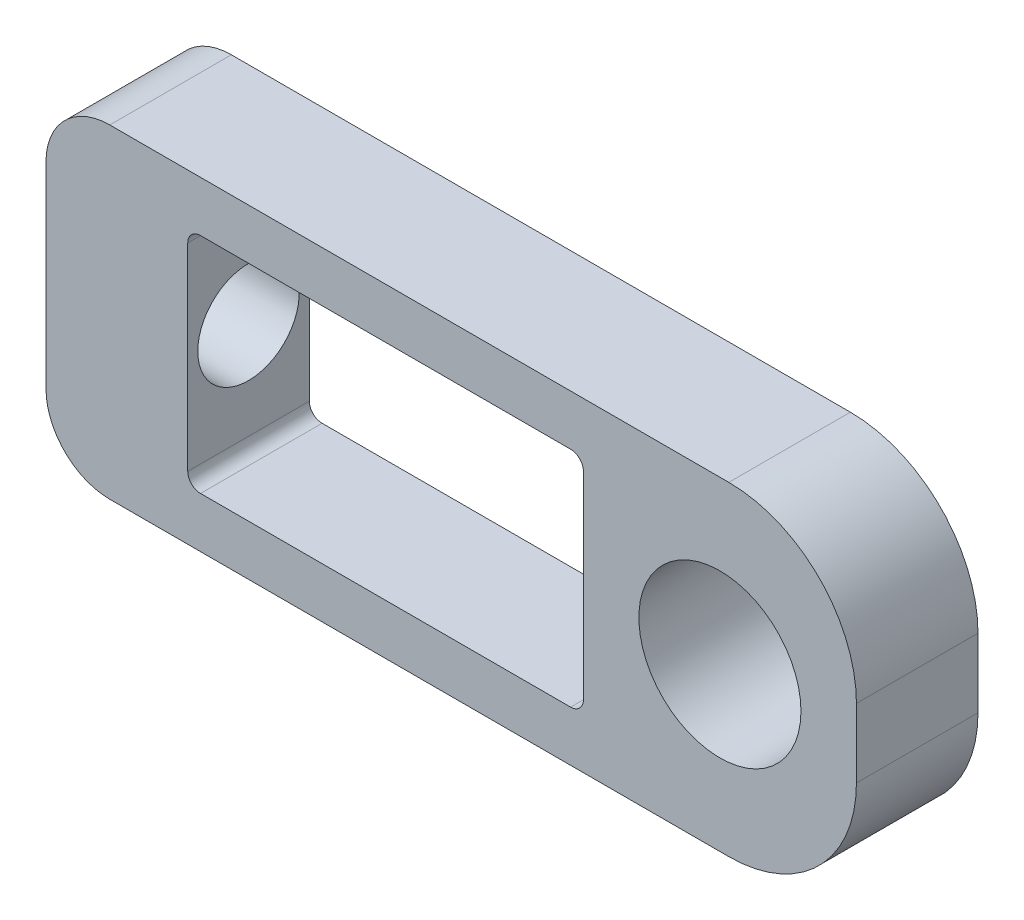
ISO-10303-21;
HEADER;
FILE_DESCRIPTION(('STEP AP214'),'2;1');
FILE_NAME('part.step','',(''),(''),'','','');
FILE_SCHEMA(('AUTOMOTIVE_DESIGN { 1 0 10303 214 1 1 1 1 }'));
ENDSEC;
DATA;
#1=APPLICATION_CONTEXT('core data for automotive mechanical design processes');
#2=APPLICATION_PROTOCOL_DEFINITION('international standard','automotive_design',2000,#1);
#3=PRODUCT_CONTEXT('',#1,'mechanical');
#4=PRODUCT('Part','Part','',(#3));
#5=PRODUCT_RELATED_PRODUCT_CATEGORY('part','',(#4));
#6=PRODUCT_DEFINITION_FORMATION('','',#4);
#7=PRODUCT_DEFINITION_CONTEXT('part definition',#1,'design');
#8=PRODUCT_DEFINITION('design','',#6,#7);
#9=PRODUCT_DEFINITION_SHAPE('','',#8);
#10=(LENGTH_UNIT() NAMED_UNIT(*) SI_UNIT(.MILLI.,.METRE.));
#11=(NAMED_UNIT(*) PLANE_ANGLE_UNIT() SI_UNIT($,.RADIAN.));
#12=(NAMED_UNIT(*) SI_UNIT($,.STERADIAN.) SOLID_ANGLE_UNIT());
#13=UNCERTAINTY_MEASURE_WITH_UNIT(LENGTH_MEASURE(1.E-05),#10,'distance_accuracy_value','');
#14=(GEOMETRIC_REPRESENTATION_CONTEXT(3) GLOBAL_UNCERTAINTY_ASSIGNED_CONTEXT((#13)) GLOBAL_UNIT_ASSIGNED_CONTEXT((#10,
#11,#12)) REPRESENTATION_CONTEXT('',''));
#15=CARTESIAN_POINT('',(0.,0.,0.));
#16=DIRECTION('',(0.,0.,1.));
#17=DIRECTION('',(1.,0.,0.));
#18=AXIS2_PLACEMENT_3D('',#15,#16,#17);
#19=CARTESIAN_POINT('',(0.,0.,9.525));
#20=DIRECTION('',(1.,0.,0.));
#21=DIRECTION('',(0.,0.,-1.));
#22=AXIS2_PLACEMENT_3D('',#19,#20,#21);
#23=PLANE('',#22);
#24=CARTESIAN_POINT('',(0.,12.7,4.7625));
#25=DIRECTION('',(-1.,0.,0.));
#26=DIRECTION('',(0.,0.,1.));
#27=AXIS2_PLACEMENT_3D('',#24,#25,#26);
#28=CIRCLE('',#27,3.9751);
#29=CARTESIAN_POINT('',(0.,12.7,8.7376));
#30=VERTEX_POINT('',#29);
#31=EDGE_CURVE('E300',#30,#30,#28,.T.);
#32=ORIENTED_EDGE('',*,*,#31,.F.);
#33=EDGE_LOOP('',(#32));
#34=FACE_BOUND('',#33,.T.);
#35=DIRECTION('',(0.,-1.,0.));
#36=VECTOR('',#35,1.);
#37=CARTESIAN_POINT('',(0.,0.,0.));
#38=LINE('',#37,#36);
#39=CARTESIAN_POINT('',(0.,20.4,0.));
#40=VERTEX_POINT('',#39);
#41=CARTESIAN_POINT('',(0.,5.,0.));
#42=VERTEX_POINT('',#41);
#43=EDGE_CURVE('E179',#40,#42,#38,.T.);
#44=ORIENTED_EDGE('',*,*,#43,.T.);
#45=DIRECTION('',(0.,0.,-1.));
#46=VECTOR('',#45,1.);
#47=CARTESIAN_POINT('',(0.,5.,9.525));
#48=LINE('',#47,#46);
#49=CARTESIAN_POINT('',(0.,5.,9.525));
#50=VERTEX_POINT('',#49);
#51=EDGE_CURVE('E204',#42,#50,#48,.F.);
#52=ORIENTED_EDGE('',*,*,#51,.T.);
#53=DIRECTION('',(0.,-1.,0.));
#54=VECTOR('',#53,1.);
#55=CARTESIAN_POINT('',(0.,0.,9.525));
#56=LINE('',#55,#54);
#57=CARTESIAN_POINT('',(0.,20.4,9.525));
#58=VERTEX_POINT('',#57);
#59=EDGE_CURVE('E177',#58,#50,#56,.T.);
#60=ORIENTED_EDGE('',*,*,#59,.F.);
#61=DIRECTION('',(0.,0.,-1.));
#62=VECTOR('',#61,1.);
#63=CARTESIAN_POINT('',(0.,20.4,9.525));
#64=LINE('',#63,#62);
#65=EDGE_CURVE('E201',#58,#40,#64,.T.);
#66=ORIENTED_EDGE('',*,*,#65,.T.);
#67=EDGE_LOOP('',(#44,#52,#60,#66));
#68=FACE_BOUND('',#67,.T.);
#69=ADVANCED_FACE('F34',(#34,#68),#23,.F.);
#70=CARTESIAN_POINT('',(0.,0.,9.525));
#71=DIRECTION('',(0.,1.,0.));
#72=DIRECTION('',(0.,0.,1.));
#73=AXIS2_PLACEMENT_3D('',#70,#71,#72);
#74=PLANE('',#73);
#75=DIRECTION('',(1.,0.,0.));
#76=VECTOR('',#75,1.);
#77=CARTESIAN_POINT('',(0.,0.,9.525));
#78=LINE('',#77,#76);
#79=CARTESIAN_POINT('',(5.,0.,9.525));
#80=VERTEX_POINT('',#79);
#81=CARTESIAN_POINT('',(53.5,0.,9.525));
#82=VERTEX_POINT('',#81);
#83=EDGE_CURVE('E283',#80,#82,#78,.T.);
#84=ORIENTED_EDGE('',*,*,#83,.F.);
#85=DIRECTION('',(0.,0.,-1.));
#86=VECTOR('',#85,1.);
#87=CARTESIAN_POINT('',(5.,0.,9.525));
#88=LINE('',#87,#86);
#89=CARTESIAN_POINT('',(5.,0.,0.));
#90=VERTEX_POINT('',#89);
#91=EDGE_CURVE('E194',#80,#90,#88,.T.);
#92=ORIENTED_EDGE('',*,*,#91,.T.);
#93=DIRECTION('',(1.,0.,0.));
#94=VECTOR('',#93,1.);
#95=CARTESIAN_POINT('',(0.,0.,0.));
#96=LINE('',#95,#94);
#97=CARTESIAN_POINT('',(53.5,0.,0.));
#98=VERTEX_POINT('',#97);
#99=EDGE_CURVE('E174',#90,#98,#96,.T.);
#100=ORIENTED_EDGE('',*,*,#99,.T.);
#101=DIRECTION('',(0.,0.,-1.));
#102=VECTOR('',#101,1.);
#103=CARTESIAN_POINT('',(53.5,0.,9.525));
#104=LINE('',#103,#102);
#105=EDGE_CURVE('E155',#98,#82,#104,.F.);
#106=ORIENTED_EDGE('',*,*,#105,.T.);
#107=EDGE_LOOP('',(#84,#92,#100,#106));
#108=FACE_BOUND('',#107,.T.);
#109=ADVANCED_FACE('F308',(#108),#74,.F.);
#110=CARTESIAN_POINT('',(63.5,0.,9.525));
#111=DIRECTION('',(-1.,0.,0.));
#112=DIRECTION('',(0.,0.,1.));
#113=AXIS2_PLACEMENT_3D('',#110,#111,#112);
#114=PLANE('',#113);
#115=DIRECTION('',(0.,1.,0.));
#116=VECTOR('',#115,1.);
#117=CARTESIAN_POINT('',(63.5,0.,9.525));
#118=LINE('',#117,#116);
#119=CARTESIAN_POINT('',(63.5,10.,9.525));
#120=VERTEX_POINT('',#119);
#121=CARTESIAN_POINT('',(63.5,15.4,9.525));
#122=VERTEX_POINT('',#121);
#123=EDGE_CURVE('E168',#120,#122,#118,.T.);
#124=ORIENTED_EDGE('',*,*,#123,.F.);
#125=DIRECTION('',(0.,0.,-1.));
#126=VECTOR('',#125,1.);
#127=CARTESIAN_POINT('',(63.5,10.,9.525));
#128=LINE('',#127,#126);
#129=CARTESIAN_POINT('',(63.5,10.,0.));
#130=VERTEX_POINT('',#129);
#131=EDGE_CURVE('E153',#120,#130,#128,.T.);
#132=ORIENTED_EDGE('',*,*,#131,.T.);
#133=DIRECTION('',(0.,1.,0.));
#134=VECTOR('',#133,1.);
#135=CARTESIAN_POINT('',(63.5,0.,0.));
#136=LINE('',#135,#134);
#137=CARTESIAN_POINT('',(63.5,15.4,0.));
#138=VERTEX_POINT('',#137);
#139=EDGE_CURVE('E165',#130,#138,#136,.T.);
#140=ORIENTED_EDGE('',*,*,#139,.T.);
#141=DIRECTION('',(0.,0.,-1.));
#142=VECTOR('',#141,1.);
#143=CARTESIAN_POINT('',(63.5,15.4,9.525));
#144=LINE('',#143,#142);
#145=EDGE_CURVE('E169',#138,#122,#144,.F.);
#146=ORIENTED_EDGE('',*,*,#145,.T.);
#147=EDGE_LOOP('',(#124,#132,#140,#146));
#148=FACE_BOUND('',#147,.T.);
#149=ADVANCED_FACE('F164',(#148),#114,.F.);
#150=CARTESIAN_POINT('',(0.,25.4,9.525));
#151=DIRECTION('',(0.,-1.,0.));
#152=DIRECTION('',(1.,0.,0.));
#153=AXIS2_PLACEMENT_3D('',#150,#151,#152);
#154=PLANE('',#153);
#155=DIRECTION('',(-1.,0.,0.));
#156=VECTOR('',#155,1.);
#157=CARTESIAN_POINT('',(0.,25.4,0.));
#158=LINE('',#157,#156);
#159=CARTESIAN_POINT('',(53.5,25.4,0.));
#160=VERTEX_POINT('',#159);
#161=CARTESIAN_POINT('',(5.,25.4,0.));
#162=VERTEX_POINT('',#161);
#163=EDGE_CURVE('E173',#160,#162,#158,.T.);
#164=ORIENTED_EDGE('',*,*,#163,.T.);
#165=DIRECTION('',(0.,0.,-1.));
#166=VECTOR('',#165,1.);
#167=CARTESIAN_POINT('',(5.,25.4,9.525));
#168=LINE('',#167,#166);
#169=CARTESIAN_POINT('',(5.,25.4,9.525));
#170=VERTEX_POINT('',#169);
#171=EDGE_CURVE('E210',#162,#170,#168,.F.);
#172=ORIENTED_EDGE('',*,*,#171,.T.);
#173=DIRECTION('',(-1.,0.,0.));
#174=VECTOR('',#173,1.);
#175=CARTESIAN_POINT('',(0.,25.4,9.525));
#176=LINE('',#175,#174);
#177=CARTESIAN_POINT('',(53.5,25.4,9.525));
#178=VERTEX_POINT('',#177);
#179=EDGE_CURVE('E183',#178,#170,#176,.T.);
#180=ORIENTED_EDGE('',*,*,#179,.F.);
#181=DIRECTION('',(0.,0.,-1.));
#182=VECTOR('',#181,1.);
#183=CARTESIAN_POINT('',(53.5,25.4,9.525));
#184=LINE('',#183,#182);
#185=EDGE_CURVE('E191',#178,#160,#184,.T.);
#186=ORIENTED_EDGE('',*,*,#185,.T.);
#187=EDGE_LOOP('',(#164,#172,#180,#186));
#188=FACE_BOUND('',#187,.T.);
#189=ADVANCED_FACE('F374',(#188),#154,.F.);
#190=CARTESIAN_POINT('',(0.,0.,9.525));
#191=DIRECTION('',(0.,0.,-1.));
#192=DIRECTION('',(-1.,0.,0.));
#193=AXIS2_PLACEMENT_3D('',#190,#191,#192);
#194=PLANE('',#193);
#195=CARTESIAN_POINT('',(52.803125,12.7,9.525));
#196=DIRECTION('',(0.,0.,1.));
#197=DIRECTION('',(1.,0.,0.));
#198=AXIS2_PLACEMENT_3D('',#195,#196,#197);
#199=CIRCLE('',#198,6.35);
#200=CARTESIAN_POINT('',(59.153125,12.7,9.525));
#201=VERTEX_POINT('',#200);
#202=EDGE_CURVE('E273',#201,#201,#199,.T.);
#203=ORIENTED_EDGE('',*,*,#202,.F.);
#204=EDGE_LOOP('',(#203));
#205=FACE_BOUND('',#204,.T.);
#206=DIRECTION('',(-1.,0.,0.));
#207=VECTOR('',#206,1.);
#208=CARTESIAN_POINT('',(11.10625,21.45,9.525));
#209=LINE('',#208,#207);
#210=CARTESIAN_POINT('',(41.10625,21.45,9.525));
#211=VERTEX_POINT('',#210);
#212=CARTESIAN_POINT('',(12.10625,21.45,9.525));
#213=VERTEX_POINT('',#212);
#214=EDGE_CURVE('E248',#211,#213,#209,.T.);
#215=ORIENTED_EDGE('',*,*,#214,.F.);
#216=CARTESIAN_POINT('',(41.10625,20.45,9.525));
#217=DIRECTION('',(0.,0.,-1.));
#218=DIRECTION('',(-1.,0.,0.));
#219=AXIS2_PLACEMENT_3D('',#216,#217,#218);
#220=CIRCLE('',#219,1.);
#221=CARTESIAN_POINT('',(42.10625,20.45,9.525));
#222=VERTEX_POINT('',#221);
#223=EDGE_CURVE('E42',#211,#222,#220,.T.);
#224=ORIENTED_EDGE('',*,*,#223,.T.);
#225=DIRECTION('',(0.,1.,0.));
#226=VECTOR('',#225,1.);
#227=CARTESIAN_POINT('',(42.10625,3.95,9.525));
#228=LINE('',#227,#226);
#229=CARTESIAN_POINT('',(42.10625,4.95,9.525));
#230=VERTEX_POINT('',#229);
#231=EDGE_CURVE('E246',#230,#222,#228,.T.);
#232=ORIENTED_EDGE('',*,*,#231,.F.);
#233=CARTESIAN_POINT('',(41.10625,4.95,9.525));
#234=DIRECTION('',(0.,0.,-1.));
#235=DIRECTION('',(-1.,0.,0.));
#236=AXIS2_PLACEMENT_3D('',#233,#234,#235);
#237=CIRCLE('',#236,1.);
#238=CARTESIAN_POINT('',(41.10625,3.95,9.525));
#239=VERTEX_POINT('',#238);
#240=EDGE_CURVE('E239',#230,#239,#237,.T.);
#241=ORIENTED_EDGE('',*,*,#240,.T.);
#242=DIRECTION('',(1.,0.,0.));
#243=VECTOR('',#242,1.);
#244=CARTESIAN_POINT('',(11.10625,3.95,9.525));
#245=LINE('',#244,#243);
#246=CARTESIAN_POINT('',(12.10625,3.95,9.525));
#247=VERTEX_POINT('',#246);
#248=EDGE_CURVE('E269',#247,#239,#245,.T.);
#249=ORIENTED_EDGE('',*,*,#248,.F.);
#250=CARTESIAN_POINT('',(12.10625,4.95,9.525));
#251=DIRECTION('',(0.,0.,-1.));
#252=DIRECTION('',(-1.,0.,0.));
#253=AXIS2_PLACEMENT_3D('',#250,#251,#252);
#254=CIRCLE('',#253,1.);
#255=CARTESIAN_POINT('',(11.10625,4.95,9.525));
#256=VERTEX_POINT('',#255);
#257=EDGE_CURVE('E235',#247,#256,#254,.T.);
#258=ORIENTED_EDGE('',*,*,#257,.T.);
#259=DIRECTION('',(0.,-1.,0.));
#260=VECTOR('',#259,1.);
#261=CARTESIAN_POINT('',(11.10625,3.95,9.525));
#262=LINE('',#261,#260);
#263=CARTESIAN_POINT('',(11.10625,20.45,9.525));
#264=VERTEX_POINT('',#263);
#265=EDGE_CURVE('E276',#264,#256,#262,.T.);
#266=ORIENTED_EDGE('',*,*,#265,.F.);
#267=CARTESIAN_POINT('',(12.10625,20.45,9.525));
#268=DIRECTION('',(0.,0.,-1.));
#269=DIRECTION('',(-1.,0.,0.));
#270=AXIS2_PLACEMENT_3D('',#267,#268,#269);
#271=CIRCLE('',#270,1.);
#272=EDGE_CURVE('E231',#264,#213,#271,.T.);
#273=ORIENTED_EDGE('',*,*,#272,.T.);
#274=EDGE_LOOP('',(#215,#224,#232,#241,#249,#258,#266,#273));
#275=FACE_BOUND('',#274,.T.);
#276=ORIENTED_EDGE('',*,*,#59,.T.);
#277=CARTESIAN_POINT('',(5.,5.,9.525));
#278=DIRECTION('',(0.,0.,-1.));
#279=DIRECTION('',(-1.,0.,0.));
#280=AXIS2_PLACEMENT_3D('',#277,#278,#279);
#281=CIRCLE('',#280,5.);
#282=EDGE_CURVE('E208',#50,#80,#281,.F.);
#283=ORIENTED_EDGE('',*,*,#282,.T.);
#284=ORIENTED_EDGE('',*,*,#83,.T.);
#285=CARTESIAN_POINT('',(53.5,10.,9.525));
#286=DIRECTION('',(0.,0.,-1.));
#287=DIRECTION('',(-1.,0.,0.));
#288=AXIS2_PLACEMENT_3D('',#285,#286,#287);
#289=CIRCLE('',#288,10.);
#290=EDGE_CURVE('E189',#82,#120,#289,.F.);
#291=ORIENTED_EDGE('',*,*,#290,.T.);
#292=ORIENTED_EDGE('',*,*,#123,.T.);
#293=CARTESIAN_POINT('',(53.5,15.4,9.525));
#294=DIRECTION('',(0.,0.,-1.));
#295=DIRECTION('',(-1.,0.,0.));
#296=AXIS2_PLACEMENT_3D('',#293,#294,#295);
#297=CIRCLE('',#296,10.);
#298=EDGE_CURVE('E187',#122,#178,#297,.F.);
#299=ORIENTED_EDGE('',*,*,#298,.T.);
#300=ORIENTED_EDGE('',*,*,#179,.T.);
#301=CARTESIAN_POINT('',(5.,20.4,9.525));
#302=DIRECTION('',(0.,0.,-1.));
#303=DIRECTION('',(-1.,0.,0.));
#304=AXIS2_PLACEMENT_3D('',#301,#302,#303);
#305=CIRCLE('',#304,5.);
#306=EDGE_CURVE('E206',#170,#58,#305,.F.);
#307=ORIENTED_EDGE('',*,*,#306,.T.);
#308=EDGE_LOOP('',(#276,#283,#284,#291,#292,#299,#300,#307));
#309=FACE_BOUND('',#308,.T.);
#310=ADVANCED_FACE('F244',(#205,#275,#309),#194,.F.);
#311=CARTESIAN_POINT('',(0.,0.,0.));
#312=DIRECTION('',(0.,0.,-1.));
#313=DIRECTION('',(-1.,0.,0.));
#314=AXIS2_PLACEMENT_3D('',#311,#312,#313);
#315=PLANE('',#314);
#316=CARTESIAN_POINT('',(52.803125,12.7,0.));
#317=DIRECTION('',(0.,0.,1.));
#318=DIRECTION('',(1.,0.,0.));
#319=AXIS2_PLACEMENT_3D('',#316,#317,#318);
#320=CIRCLE('',#319,6.35);
#321=CARTESIAN_POINT('',(59.153125,12.7,0.));
#322=VERTEX_POINT('',#321);
#323=EDGE_CURVE('E288',#322,#322,#320,.T.);
#324=ORIENTED_EDGE('',*,*,#323,.T.);
#325=EDGE_LOOP('',(#324));
#326=FACE_BOUND('',#325,.T.);
#327=DIRECTION('',(1.,0.,0.));
#328=VECTOR('',#327,1.);
#329=CARTESIAN_POINT('',(11.10625,3.95,0.));
#330=LINE('',#329,#328);
#331=CARTESIAN_POINT('',(12.10625,3.95,0.));
#332=VERTEX_POINT('',#331);
#333=CARTESIAN_POINT('',(41.10625,3.95,0.));
#334=VERTEX_POINT('',#333);
#335=EDGE_CURVE('E267',#332,#334,#330,.T.);
#336=ORIENTED_EDGE('',*,*,#335,.T.);
#337=CARTESIAN_POINT('',(41.10625,4.95,0.));
#338=DIRECTION('',(0.,0.,-1.));
#339=DIRECTION('',(-1.,0.,0.));
#340=AXIS2_PLACEMENT_3D('',#337,#338,#339);
#341=CIRCLE('',#340,1.);
#342=CARTESIAN_POINT('',(42.10625,4.95,0.));
#343=VERTEX_POINT('',#342);
#344=EDGE_CURVE('E56',#334,#343,#341,.F.);
#345=ORIENTED_EDGE('',*,*,#344,.T.);
#346=DIRECTION('',(0.,1.,0.));
#347=VECTOR('',#346,1.);
#348=CARTESIAN_POINT('',(42.10625,3.95,0.));
#349=LINE('',#348,#347);
#350=CARTESIAN_POINT('',(42.10625,20.45,0.));
#351=VERTEX_POINT('',#350);
#352=EDGE_CURVE('E260',#343,#351,#349,.T.);
#353=ORIENTED_EDGE('',*,*,#352,.T.);
#354=CARTESIAN_POINT('',(41.10625,20.45,0.));
#355=DIRECTION('',(0.,0.,-1.));
#356=DIRECTION('',(-1.,0.,0.));
#357=AXIS2_PLACEMENT_3D('',#354,#355,#356);
#358=CIRCLE('',#357,1.);
#359=CARTESIAN_POINT('',(41.10625,21.45,0.));
#360=VERTEX_POINT('',#359);
#361=EDGE_CURVE('E11',#351,#360,#358,.F.);
#362=ORIENTED_EDGE('',*,*,#361,.T.);
#363=DIRECTION('',(-1.,0.,0.));
#364=VECTOR('',#363,1.);
#365=CARTESIAN_POINT('',(11.10625,21.45,0.));
#366=LINE('',#365,#364);
#367=CARTESIAN_POINT('',(12.10625,21.45,0.));
#368=VERTEX_POINT('',#367);
#369=EDGE_CURVE('E258',#360,#368,#366,.T.);
#370=ORIENTED_EDGE('',*,*,#369,.T.);
#371=CARTESIAN_POINT('',(12.10625,20.45,0.));
#372=DIRECTION('',(0.,0.,-1.));
#373=DIRECTION('',(-1.,0.,0.));
#374=AXIS2_PLACEMENT_3D('',#371,#372,#373);
#375=CIRCLE('',#374,1.);
#376=CARTESIAN_POINT('',(11.10625,20.45,0.));
#377=VERTEX_POINT('',#376);
#378=EDGE_CURVE('E233',#368,#377,#375,.F.);
#379=ORIENTED_EDGE('',*,*,#378,.T.);
#380=DIRECTION('',(0.,-1.,0.));
#381=VECTOR('',#380,1.);
#382=CARTESIAN_POINT('',(11.10625,3.95,0.));
#383=LINE('',#382,#381);
#384=CARTESIAN_POINT('',(11.10625,4.95,0.));
#385=VERTEX_POINT('',#384);
#386=EDGE_CURVE('E264',#377,#385,#383,.T.);
#387=ORIENTED_EDGE('',*,*,#386,.T.);
#388=CARTESIAN_POINT('',(12.10625,4.95,0.));
#389=DIRECTION('',(0.,0.,-1.));
#390=DIRECTION('',(-1.,0.,0.));
#391=AXIS2_PLACEMENT_3D('',#388,#389,#390);
#392=CIRCLE('',#391,1.);
#393=EDGE_CURVE('E237',#385,#332,#392,.F.);
#394=ORIENTED_EDGE('',*,*,#393,.T.);
#395=EDGE_LOOP('',(#336,#345,#353,#362,#370,#379,#387,#394));
#396=FACE_BOUND('',#395,.T.);
#397=ORIENTED_EDGE('',*,*,#99,.F.);
#398=CARTESIAN_POINT('',(5.,5.,0.));
#399=DIRECTION('',(0.,0.,-1.));
#400=DIRECTION('',(-1.,0.,0.));
#401=AXIS2_PLACEMENT_3D('',#398,#399,#400);
#402=CIRCLE('',#401,5.);
#403=EDGE_CURVE('E199',#90,#42,#402,.T.);
#404=ORIENTED_EDGE('',*,*,#403,.T.);
#405=ORIENTED_EDGE('',*,*,#43,.F.);
#406=CARTESIAN_POINT('',(5.,20.4,0.));
#407=DIRECTION('',(0.,0.,-1.));
#408=DIRECTION('',(-1.,0.,0.));
#409=AXIS2_PLACEMENT_3D('',#406,#407,#408);
#410=CIRCLE('',#409,5.);
#411=EDGE_CURVE('E197',#40,#162,#410,.T.);
#412=ORIENTED_EDGE('',*,*,#411,.T.);
#413=ORIENTED_EDGE('',*,*,#163,.F.);
#414=CARTESIAN_POINT('',(53.5,15.4,0.));
#415=DIRECTION('',(0.,0.,-1.));
#416=DIRECTION('',(-1.,0.,0.));
#417=AXIS2_PLACEMENT_3D('',#414,#415,#416);
#418=CIRCLE('',#417,10.);
#419=EDGE_CURVE('E159',#160,#138,#418,.T.);
#420=ORIENTED_EDGE('',*,*,#419,.T.);
#421=ORIENTED_EDGE('',*,*,#139,.F.);
#422=CARTESIAN_POINT('',(53.5,10.,0.));
#423=DIRECTION('',(0.,0.,-1.));
#424=DIRECTION('',(-1.,0.,0.));
#425=AXIS2_PLACEMENT_3D('',#422,#423,#424);
#426=CIRCLE('',#425,10.);
#427=EDGE_CURVE('E149',#130,#98,#426,.T.);
#428=ORIENTED_EDGE('',*,*,#427,.T.);
#429=EDGE_LOOP('',(#397,#404,#405,#412,#413,#420,#421,#428));
#430=FACE_BOUND('',#429,.T.);
#431=ADVANCED_FACE('F171',(#326,#396,#430),#315,.T.);
#432=CARTESIAN_POINT('',(42.10625,3.95,0.));
#433=DIRECTION('',(1.,0.,0.));
#434=DIRECTION('',(0.,0.,-1.));
#435=AXIS2_PLACEMENT_3D('',#432,#433,#434);
#436=PLANE('',#435);
#437=ORIENTED_EDGE('',*,*,#352,.F.);
#438=DIRECTION('',(0.,0.,1.));
#439=VECTOR('',#438,1.);
#440=CARTESIAN_POINT('',(42.10625,4.95,9.525));
#441=LINE('',#440,#439);
#442=EDGE_CURVE('E228',#343,#230,#441,.T.);
#443=ORIENTED_EDGE('',*,*,#442,.T.);
#444=ORIENTED_EDGE('',*,*,#231,.T.);
#445=DIRECTION('',(0.,0.,1.));
#446=VECTOR('',#445,1.);
#447=CARTESIAN_POINT('',(42.10625,20.45,0.));
#448=LINE('',#447,#446);
#449=EDGE_CURVE('E49',#222,#351,#448,.F.);
#450=ORIENTED_EDGE('',*,*,#449,.T.);
#451=EDGE_LOOP('',(#437,#443,#444,#450));
#452=FACE_BOUND('',#451,.T.);
#453=ADVANCED_FACE('F251',(#452),#436,.F.);
#454=CARTESIAN_POINT('',(11.10625,3.95,0.));
#455=DIRECTION('',(0.,-1.,0.));
#456=DIRECTION('',(0.,0.,-1.));
#457=AXIS2_PLACEMENT_3D('',#454,#455,#456);
#458=PLANE('',#457);
#459=ORIENTED_EDGE('',*,*,#335,.F.);
#460=DIRECTION('',(0.,0.,1.));
#461=VECTOR('',#460,1.);
#462=CARTESIAN_POINT('',(12.10625,3.95,9.525));
#463=LINE('',#462,#461);
#464=EDGE_CURVE('E224',#332,#247,#463,.T.);
#465=ORIENTED_EDGE('',*,*,#464,.T.);
#466=ORIENTED_EDGE('',*,*,#248,.T.);
#467=DIRECTION('',(0.,0.,1.));
#468=VECTOR('',#467,1.);
#469=CARTESIAN_POINT('',(41.10625,3.95,0.));
#470=LINE('',#469,#468);
#471=EDGE_CURVE('E222',#239,#334,#470,.F.);
#472=ORIENTED_EDGE('',*,*,#471,.T.);
#473=EDGE_LOOP('',(#459,#465,#466,#472));
#474=FACE_BOUND('',#473,.T.);
#475=ADVANCED_FACE('F348',(#474),#458,.F.);
#476=CARTESIAN_POINT('',(11.10625,3.95,0.));
#477=DIRECTION('',(-1.,0.,0.));
#478=DIRECTION('',(0.,0.,1.));
#479=AXIS2_PLACEMENT_3D('',#476,#477,#478);
#480=PLANE('',#479);
#481=CARTESIAN_POINT('',(11.10625,12.7,4.7625));
#482=DIRECTION('',(-1.,0.,0.));
#483=DIRECTION('',(0.,0.,1.));
#484=AXIS2_PLACEMENT_3D('',#481,#482,#483);
#485=CIRCLE('',#484,3.9751);
#486=CARTESIAN_POINT('',(11.10625,12.7,8.7376));
#487=VERTEX_POINT('',#486);
#488=EDGE_CURVE('E253',#487,#487,#485,.F.);
#489=ORIENTED_EDGE('',*,*,#488,.F.);
#490=EDGE_LOOP('',(#489));
#491=FACE_BOUND('',#490,.T.);
#492=ORIENTED_EDGE('',*,*,#386,.F.);
#493=DIRECTION('',(0.,0.,1.));
#494=VECTOR('',#493,1.);
#495=CARTESIAN_POINT('',(11.10625,20.45,9.525));
#496=LINE('',#495,#494);
#497=EDGE_CURVE('E214',#377,#264,#496,.T.);
#498=ORIENTED_EDGE('',*,*,#497,.T.);
#499=ORIENTED_EDGE('',*,*,#265,.T.);
#500=DIRECTION('',(0.,0.,1.));
#501=VECTOR('',#500,1.);
#502=CARTESIAN_POINT('',(11.10625,4.95,0.));
#503=LINE('',#502,#501);
#504=EDGE_CURVE('E212',#256,#385,#503,.F.);
#505=ORIENTED_EDGE('',*,*,#504,.T.);
#506=EDGE_LOOP('',(#492,#498,#499,#505));
#507=FACE_BOUND('',#506,.T.);
#508=ADVANCED_FACE('F355',(#491,#507),#480,.F.);
#509=CARTESIAN_POINT('',(11.10625,21.45,0.));
#510=DIRECTION('',(0.,1.,0.));
#511=DIRECTION('',(0.,0.,1.));
#512=AXIS2_PLACEMENT_3D('',#509,#510,#511);
#513=PLANE('',#512);
#514=ORIENTED_EDGE('',*,*,#214,.T.);
#515=DIRECTION('',(0.,0.,1.));
#516=VECTOR('',#515,1.);
#517=CARTESIAN_POINT('',(12.10625,21.45,0.));
#518=LINE('',#517,#516);
#519=EDGE_CURVE('E220',#213,#368,#518,.F.);
#520=ORIENTED_EDGE('',*,*,#519,.T.);
#521=ORIENTED_EDGE('',*,*,#369,.F.);
#522=DIRECTION('',(0.,0.,1.));
#523=VECTOR('',#522,1.);
#524=CARTESIAN_POINT('',(41.10625,21.45,9.525));
#525=LINE('',#524,#523);
#526=EDGE_CURVE('E217',#360,#211,#525,.T.);
#527=ORIENTED_EDGE('',*,*,#526,.T.);
#528=EDGE_LOOP('',(#514,#520,#521,#527));
#529=FACE_BOUND('',#528,.T.);
#530=ADVANCED_FACE('F262',(#529),#513,.F.);
#531=CARTESIAN_POINT('',(52.803125,12.7,0.));
#532=DIRECTION('',(0.,0.,1.));
#533=DIRECTION('',(1.,0.,0.));
#534=AXIS2_PLACEMENT_3D('',#531,#532,#533);
#535=CYLINDRICAL_SURFACE('',#534,6.35);
#536=CARTESIAN_POINT('',(59.153125,12.7,0.));
#537=CARTESIAN_POINT('',(59.153125,12.7,0.0992187499999999));
#538=CARTESIAN_POINT('',(59.153125,12.7,0.1984375));
#539=CARTESIAN_POINT('',(59.153125,12.7,0.396875));
#540=CARTESIAN_POINT('',(59.153125,12.7,0.49609375));
#541=CARTESIAN_POINT('',(59.153125,12.7,0.69453125));
#542=CARTESIAN_POINT('',(59.153125,12.7,0.79375));
#543=CARTESIAN_POINT('',(59.153125,12.7,0.9921875));
#544=CARTESIAN_POINT('',(59.153125,12.7,1.09140625));
#545=CARTESIAN_POINT('',(59.153125,12.7,1.28984375));
#546=CARTESIAN_POINT('',(59.153125,12.7,1.3890625));
#547=CARTESIAN_POINT('',(59.153125,12.7,1.5875));
#548=CARTESIAN_POINT('',(59.153125,12.7,1.68671875));
#549=CARTESIAN_POINT('',(59.153125,12.7,1.88515625));
#550=CARTESIAN_POINT('',(59.153125,12.7,1.984375));
#551=CARTESIAN_POINT('',(59.153125,12.7,2.1828125));
#552=CARTESIAN_POINT('',(59.153125,12.7,2.28203125));
#553=CARTESIAN_POINT('',(59.153125,12.7,2.48046875));
#554=CARTESIAN_POINT('',(59.153125,12.7,2.5796875));
#555=CARTESIAN_POINT('',(59.153125,12.7,2.778125));
#556=CARTESIAN_POINT('',(59.153125,12.7,2.87734375));
#557=CARTESIAN_POINT('',(59.153125,12.7,3.07578125));
#558=CARTESIAN_POINT('',(59.153125,12.7,3.175));
#559=CARTESIAN_POINT('',(59.153125,12.7,3.3734375));
#560=CARTESIAN_POINT('',(59.153125,12.7,3.47265625));
#561=CARTESIAN_POINT('',(59.153125,12.7,3.67109375));
#562=CARTESIAN_POINT('',(59.153125,12.7,3.7703125));
#563=CARTESIAN_POINT('',(59.153125,12.7,3.96875));
#564=CARTESIAN_POINT('',(59.153125,12.7,4.06796875));
#565=CARTESIAN_POINT('',(59.153125,12.7,4.26640625));
#566=CARTESIAN_POINT('',(59.153125,12.7,4.365625));
#567=CARTESIAN_POINT('',(59.153125,12.7,4.5640625));
#568=CARTESIAN_POINT('',(59.153125,12.7,4.66328125));
#569=CARTESIAN_POINT('',(59.153125,12.7,4.86171875));
#570=CARTESIAN_POINT('',(59.153125,12.7,4.9609375));
#571=CARTESIAN_POINT('',(59.153125,12.7,5.159375));
#572=CARTESIAN_POINT('',(59.153125,12.7,5.25859375));
#573=CARTESIAN_POINT('',(59.153125,12.7,5.45703125));
#574=CARTESIAN_POINT('',(59.153125,12.7,5.55625));
#575=CARTESIAN_POINT('',(59.153125,12.7,5.7546875));
#576=CARTESIAN_POINT('',(59.153125,12.7,5.85390625));
#577=CARTESIAN_POINT('',(59.153125,12.7,6.05234375));
#578=CARTESIAN_POINT('',(59.153125,12.7,6.1515625));
#579=CARTESIAN_POINT('',(59.153125,12.7,6.35));
#580=CARTESIAN_POINT('',(59.153125,12.7,6.44921875));
#581=CARTESIAN_POINT('',(59.153125,12.7,6.64765625));
#582=CARTESIAN_POINT('',(59.153125,12.7,6.746875));
#583=CARTESIAN_POINT('',(59.153125,12.7,6.9453125));
#584=CARTESIAN_POINT('',(59.153125,12.7,7.04453125));
#585=CARTESIAN_POINT('',(59.153125,12.7,7.24296875));
#586=CARTESIAN_POINT('',(59.153125,12.7,7.3421875));
#587=CARTESIAN_POINT('',(59.153125,12.7,7.540625));
#588=CARTESIAN_POINT('',(59.153125,12.7,7.63984375));
#589=CARTESIAN_POINT('',(59.153125,12.7,7.83828125));
#590=CARTESIAN_POINT('',(59.153125,12.7,7.9375));
#591=CARTESIAN_POINT('',(59.153125,12.7,8.1359375));
#592=CARTESIAN_POINT('',(59.153125,12.7,8.23515625));
#593=CARTESIAN_POINT('',(59.153125,12.7,8.43359375));
#594=CARTESIAN_POINT('',(59.153125,12.7,8.5328125));
#595=CARTESIAN_POINT('',(59.153125,12.7,8.73125));
#596=CARTESIAN_POINT('',(59.153125,12.7,8.83046875));
#597=CARTESIAN_POINT('',(59.153125,12.7,9.02890625));
#598=CARTESIAN_POINT('',(59.153125,12.7,9.128125));
#599=CARTESIAN_POINT('',(59.153125,12.7,9.3265625));
#600=CARTESIAN_POINT('',(59.153125,12.7,9.42578125));
#601=CARTESIAN_POINT('',(59.153125,12.7,9.525));
#602=B_SPLINE_CURVE_WITH_KNOTS('',3,(#536,#537,#538,#539,#540,#541,#542,#543,#544,#545,#546,
#547,#548,#549,#550,#551,#552,#553,#554,#555,#556,#557,#558,#559,#560,#561,#562,#563,#564,#565,
#566,#567,#568,#569,#570,#571,#572,#573,#574,#575,#576,#577,#578,#579,#580,#581,#582,#583,#584,
#585,#586,#587,#588,#589,#590,#591,#592,#593,#594,#595,#596,#597,#598,#599,#600,#601),
.UNSPECIFIED.,.F.,.F.,(4,2,2,2,2,2,2,2,2,2,2,2,2,2,2,2,2,2,2,2,2,2,2,2,2,2,2,2,2,2,2,2,4),(0.,
0.29765625,0.5953125,0.89296875,1.190625,1.48828125,1.7859375,2.08359375,2.38125,2.67890625,
2.9765625,3.27421875,3.571875,3.86953125,4.1671875,4.46484375,4.7625,5.06015625,5.3578125,
5.65546875,5.953125,6.25078125,6.5484375,6.84609375,7.14375,7.44140625,7.7390625,8.03671875,
8.334375,8.63203125,8.9296875,9.22734375,9.525),.UNSPECIFIED.);
#603=EDGE_CURVE('BSEAM364',#322,#201,#602,.T.);
#604=ORIENTED_EDGE('',*,*,#323,.F.);
#605=ORIENTED_EDGE('',*,*,#202,.T.);
#606=ORIENTED_EDGE('',*,*,#603,.T.);
#607=ORIENTED_EDGE('',*,*,#603,.F.);
#608=EDGE_LOOP('',(#604,#606,#605,#607));
#609=FACE_BOUND('',#608,.T.);
#610=ADVANCED_FACE('F364',(#609),#535,.F.);
#611=CARTESIAN_POINT('',(63.501,12.7,4.7625));
#612=DIRECTION('',(-1.,0.,0.));
#613=DIRECTION('',(0.,0.,1.));
#614=AXIS2_PLACEMENT_3D('',#611,#612,#613);
#615=CYLINDRICAL_SURFACE('',#614,3.9751);
#616=ORIENTED_EDGE('',*,*,#31,.T.);
#617=EDGE_LOOP('',(#616));
#618=FACE_BOUND('',#617,.T.);
#619=ORIENTED_EDGE('',*,*,#488,.T.);
#620=EDGE_LOOP('',(#619));
#621=FACE_BOUND('',#620,.T.);
#622=ADVANCED_FACE('F304',(#618,#621),#615,.F.);
#623=CARTESIAN_POINT('',(53.5,10.,9.525));
#624=DIRECTION('',(0.,0.,-1.));
#625=DIRECTION('',(-1.,0.,0.));
#626=AXIS2_PLACEMENT_3D('',#623,#624,#625);
#627=CYLINDRICAL_SURFACE('',#626,10.);
#628=ORIENTED_EDGE('',*,*,#290,.F.);
#629=ORIENTED_EDGE('',*,*,#105,.F.);
#630=ORIENTED_EDGE('',*,*,#427,.F.);
#631=ORIENTED_EDGE('',*,*,#131,.F.);
#632=EDGE_LOOP('',(#628,#629,#630,#631));
#633=FACE_BOUND('',#632,.T.);
#634=ADVANCED_FACE('F152',(#633),#627,.T.);
#635=CARTESIAN_POINT('',(53.5,15.4,9.525));
#636=DIRECTION('',(0.,0.,-1.));
#637=DIRECTION('',(-1.,0.,0.));
#638=AXIS2_PLACEMENT_3D('',#635,#636,#637);
#639=CYLINDRICAL_SURFACE('',#638,10.);
#640=ORIENTED_EDGE('',*,*,#298,.F.);
#641=ORIENTED_EDGE('',*,*,#145,.F.);
#642=ORIENTED_EDGE('',*,*,#419,.F.);
#643=ORIENTED_EDGE('',*,*,#185,.F.);
#644=EDGE_LOOP('',(#640,#641,#642,#643));
#645=FACE_BOUND('',#644,.T.);
#646=ADVANCED_FACE('F319',(#645),#639,.T.);
#647=CARTESIAN_POINT('',(5.,5.,9.525));
#648=DIRECTION('',(0.,0.,-1.));
#649=DIRECTION('',(-1.,0.,0.));
#650=AXIS2_PLACEMENT_3D('',#647,#648,#649);
#651=CYLINDRICAL_SURFACE('',#650,5.);
#652=ORIENTED_EDGE('',*,*,#282,.F.);
#653=ORIENTED_EDGE('',*,*,#51,.F.);
#654=ORIENTED_EDGE('',*,*,#403,.F.);
#655=ORIENTED_EDGE('',*,*,#91,.F.);
#656=EDGE_LOOP('',(#652,#653,#654,#655));
#657=FACE_BOUND('',#656,.T.);
#658=ADVANCED_FACE('F322',(#657),#651,.T.);
#659=CARTESIAN_POINT('',(5.,20.4,9.525));
#660=DIRECTION('',(0.,0.,-1.));
#661=DIRECTION('',(-1.,0.,0.));
#662=AXIS2_PLACEMENT_3D('',#659,#660,#661);
#663=CYLINDRICAL_SURFACE('',#662,5.);
#664=ORIENTED_EDGE('',*,*,#306,.F.);
#665=ORIENTED_EDGE('',*,*,#171,.F.);
#666=ORIENTED_EDGE('',*,*,#411,.F.);
#667=ORIENTED_EDGE('',*,*,#65,.F.);
#668=EDGE_LOOP('',(#664,#665,#666,#667));
#669=FACE_BOUND('',#668,.T.);
#670=ADVANCED_FACE('F326',(#669),#663,.T.);
#671=CARTESIAN_POINT('',(12.10625,20.45,0.));
#672=DIRECTION('',(0.,0.,-1.));
#673=DIRECTION('',(-1.,0.,0.));
#674=AXIS2_PLACEMENT_3D('',#671,#672,#673);
#675=CYLINDRICAL_SURFACE('',#674,1.);
#676=ORIENTED_EDGE('',*,*,#378,.F.);
#677=ORIENTED_EDGE('',*,*,#519,.F.);
#678=ORIENTED_EDGE('',*,*,#272,.F.);
#679=ORIENTED_EDGE('',*,*,#497,.F.);
#680=EDGE_LOOP('',(#676,#677,#678,#679));
#681=FACE_BOUND('',#680,.T.);
#682=ADVANCED_FACE('F330',(#681),#675,.F.);
#683=CARTESIAN_POINT('',(12.10625,4.95,0.));
#684=DIRECTION('',(0.,0.,-1.));
#685=DIRECTION('',(-1.,0.,0.));
#686=AXIS2_PLACEMENT_3D('',#683,#684,#685);
#687=CYLINDRICAL_SURFACE('',#686,1.);
#688=ORIENTED_EDGE('',*,*,#393,.F.);
#689=ORIENTED_EDGE('',*,*,#504,.F.);
#690=ORIENTED_EDGE('',*,*,#257,.F.);
#691=ORIENTED_EDGE('',*,*,#464,.F.);
#692=EDGE_LOOP('',(#688,#689,#690,#691));
#693=FACE_BOUND('',#692,.T.);
#694=ADVANCED_FACE('F334',(#693),#687,.F.);
#695=CARTESIAN_POINT('',(41.10625,4.95,0.));
#696=DIRECTION('',(0.,0.,-1.));
#697=DIRECTION('',(-1.,0.,0.));
#698=AXIS2_PLACEMENT_3D('',#695,#696,#697);
#699=CYLINDRICAL_SURFACE('',#698,1.);
#700=ORIENTED_EDGE('',*,*,#344,.F.);
#701=ORIENTED_EDGE('',*,*,#471,.F.);
#702=ORIENTED_EDGE('',*,*,#240,.F.);
#703=ORIENTED_EDGE('',*,*,#442,.F.);
#704=EDGE_LOOP('',(#700,#701,#702,#703));
#705=FACE_BOUND('',#704,.T.);
#706=ADVANCED_FACE('F337',(#705),#699,.F.);
#707=CARTESIAN_POINT('',(41.10625,20.45,0.));
#708=DIRECTION('',(0.,0.,-1.));
#709=DIRECTION('',(-1.,0.,0.));
#710=AXIS2_PLACEMENT_3D('',#707,#708,#709);
#711=CYLINDRICAL_SURFACE('',#710,1.);
#712=ORIENTED_EDGE('',*,*,#361,.F.);
#713=ORIENTED_EDGE('',*,*,#449,.F.);
#714=ORIENTED_EDGE('',*,*,#223,.F.);
#715=ORIENTED_EDGE('',*,*,#526,.F.);
#716=EDGE_LOOP('',(#712,#713,#714,#715));
#717=FACE_BOUND('',#716,.T.);
#718=ADVANCED_FACE('F36',(#717),#711,.F.);
#719=CLOSED_SHELL('',(#69,#109,#149,#189,#310,#431,#453,#475,#508,#530,#610,#622,#634,#646,#658,
#670,#682,#694,#706,#718));
#720=MANIFOLD_SOLID_BREP('B2',#719);
#721=ADVANCED_BREP_SHAPE_REPRESENTATION('',(#18,#720),#14);
#722=SHAPE_DEFINITION_REPRESENTATION(#9,#721);
ENDSEC;
END-ISO-10303-21;
